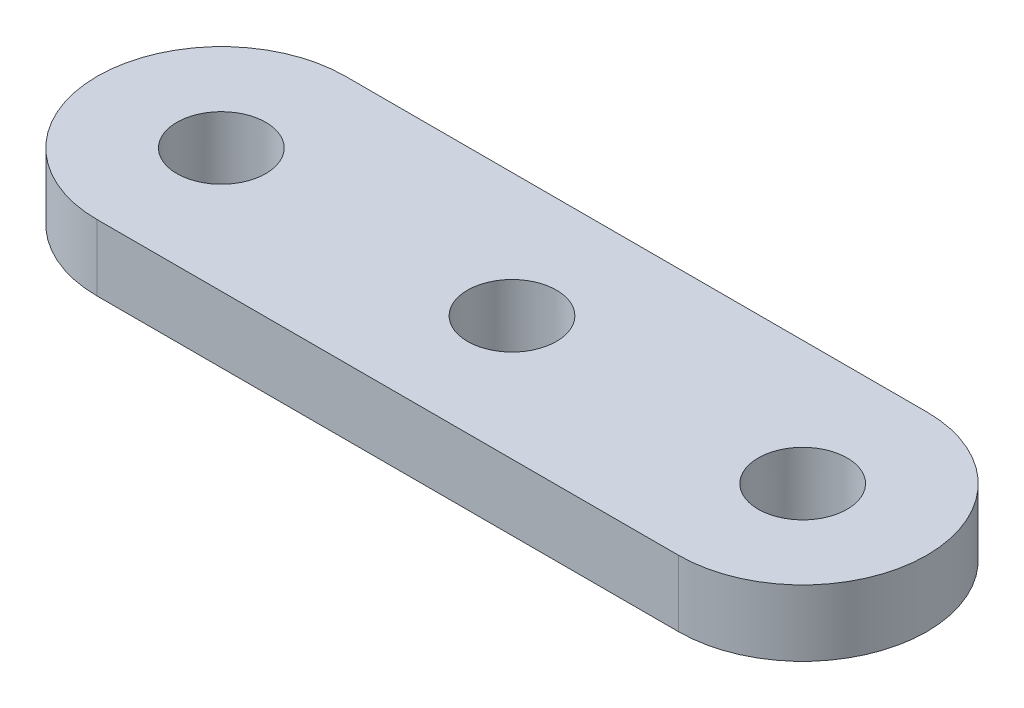
ISO-10303-21;
HEADER;
FILE_DESCRIPTION(('STEP AP214'),'2;1');
FILE_NAME('part.step','',(''),(''),'','','');
FILE_SCHEMA(('AUTOMOTIVE_DESIGN { 1 0 10303 214 1 1 1 1 }'));
ENDSEC;
DATA;
#1=APPLICATION_CONTEXT('core data for automotive mechanical design processes');
#2=APPLICATION_PROTOCOL_DEFINITION('international standard','automotive_design',2000,#1);
#3=PRODUCT_CONTEXT('',#1,'mechanical');
#4=PRODUCT('Part','Part','',(#3));
#5=PRODUCT_RELATED_PRODUCT_CATEGORY('part','',(#4));
#6=PRODUCT_DEFINITION_FORMATION('','',#4);
#7=PRODUCT_DEFINITION_CONTEXT('part definition',#1,'design');
#8=PRODUCT_DEFINITION('design','',#6,#7);
#9=PRODUCT_DEFINITION_SHAPE('','',#8);
#10=(LENGTH_UNIT() NAMED_UNIT(*) SI_UNIT(.MILLI.,.METRE.));
#11=(NAMED_UNIT(*) PLANE_ANGLE_UNIT() SI_UNIT($,.RADIAN.));
#12=(NAMED_UNIT(*) SI_UNIT($,.STERADIAN.) SOLID_ANGLE_UNIT());
#13=UNCERTAINTY_MEASURE_WITH_UNIT(LENGTH_MEASURE(1.E-05),#10,'distance_accuracy_value','');
#14=(GEOMETRIC_REPRESENTATION_CONTEXT(3) GLOBAL_UNCERTAINTY_ASSIGNED_CONTEXT((#13)) GLOBAL_UNIT_ASSIGNED_CONTEXT((#10,
#11,#12)) REPRESENTATION_CONTEXT('',''));
#15=CARTESIAN_POINT('',(0.,0.,0.));
#16=DIRECTION('',(0.,0.,1.));
#17=DIRECTION('',(1.,0.,0.));
#18=AXIS2_PLACEMENT_3D('',#15,#16,#17);
#19=CARTESIAN_POINT('',(14.05,3.2,0.));
#20=DIRECTION('',(0.,-1.,0.));
#21=DIRECTION('',(0.,0.,-1.));
#22=AXIS2_PLACEMENT_3D('',#19,#20,#21);
#23=PLANE('',#22);
#24=CARTESIAN_POINT('',(0.,3.2,0.));
#25=DIRECTION('',(0.,1.,0.));
#26=DIRECTION('',(0.,0.,1.));
#27=AXIS2_PLACEMENT_3D('',#24,#25,#26);
#28=CIRCLE('',#27,2.15);
#29=CARTESIAN_POINT('',(0.,3.2,2.15));
#30=VERTEX_POINT('',#29);
#31=EDGE_CURVE('E137',#30,#30,#28,.T.);
#32=ORIENTED_EDGE('',*,*,#31,.F.);
#33=EDGE_LOOP('',(#32));
#34=FACE_BOUND('',#33,.T.);
#35=CARTESIAN_POINT('',(14.05,3.2,0.));
#36=DIRECTION('',(0.,1.,0.));
#37=DIRECTION('',(0.,0.,-1.));
#38=AXIS2_PLACEMENT_3D('',#35,#36,#37);
#39=CIRCLE('',#38,6.);
#40=CARTESIAN_POINT('',(14.05,3.2,6.));
#41=VERTEX_POINT('',#40);
#42=CARTESIAN_POINT('',(14.05,3.2,-6.00000000000001));
#43=VERTEX_POINT('',#42);
#44=EDGE_CURVE('E97',#41,#43,#39,.T.);
#45=ORIENTED_EDGE('',*,*,#44,.T.);
#46=DIRECTION('',(-1.,0.,0.));
#47=VECTOR('',#46,1.);
#48=CARTESIAN_POINT('',(-14.05,3.2,-6.));
#49=LINE('',#48,#47);
#50=CARTESIAN_POINT('',(-14.05,3.2,-6.));
#51=VERTEX_POINT('',#50);
#52=EDGE_CURVE('E92',#43,#51,#49,.T.);
#53=ORIENTED_EDGE('',*,*,#52,.T.);
#54=CARTESIAN_POINT('',(-14.05,3.2,0.));
#55=DIRECTION('',(0.,1.,0.));
#56=DIRECTION('',(0.,0.,1.));
#57=AXIS2_PLACEMENT_3D('',#54,#55,#56);
#58=CIRCLE('',#57,6.);
#59=CARTESIAN_POINT('',(-14.05,3.2,6.));
#60=VERTEX_POINT('',#59);
#61=EDGE_CURVE('E95',#51,#60,#58,.T.);
#62=ORIENTED_EDGE('',*,*,#61,.T.);
#63=DIRECTION('',(1.,0.,0.));
#64=VECTOR('',#63,1.);
#65=CARTESIAN_POINT('',(-14.05,3.2,6.));
#66=LINE('',#65,#64);
#67=EDGE_CURVE('E62',#60,#41,#66,.T.);
#68=ORIENTED_EDGE('',*,*,#67,.T.);
#69=EDGE_LOOP('',(#45,#53,#62,#68));
#70=FACE_BOUND('',#69,.T.);
#71=CARTESIAN_POINT('',(-14.05,3.2,0.));
#72=DIRECTION('',(0.,1.,0.));
#73=DIRECTION('',(0.,0.,1.));
#74=AXIS2_PLACEMENT_3D('',#71,#72,#73);
#75=CIRCLE('',#74,2.15);
#76=CARTESIAN_POINT('',(-14.05,3.2,2.15));
#77=VERTEX_POINT('',#76);
#78=EDGE_CURVE('E125',#77,#77,#75,.T.);
#79=ORIENTED_EDGE('',*,*,#78,.F.);
#80=EDGE_LOOP('',(#79));
#81=FACE_BOUND('',#80,.T.);
#82=CARTESIAN_POINT('',(14.05,3.2,0.));
#83=DIRECTION('',(0.,1.,0.));
#84=DIRECTION('',(0.,0.,1.));
#85=AXIS2_PLACEMENT_3D('',#82,#83,#84);
#86=CIRCLE('',#85,2.15);
#87=CARTESIAN_POINT('',(14.05,3.2,2.15000000000001));
#88=VERTEX_POINT('',#87);
#89=EDGE_CURVE('E131',#88,#88,#86,.T.);
#90=ORIENTED_EDGE('',*,*,#89,.F.);
#91=EDGE_LOOP('',(#90));
#92=FACE_BOUND('',#91,.T.);
#93=ADVANCED_FACE('F45',(#34,#70,#81,#92),#23,.F.);
#94=CARTESIAN_POINT('',(14.05,3.2,0.));
#95=DIRECTION('',(0.,-1.,0.));
#96=DIRECTION('',(0.,0.,-1.));
#97=AXIS2_PLACEMENT_3D('',#94,#95,#96);
#98=CYLINDRICAL_SURFACE('',#97,6.);
#99=CARTESIAN_POINT('',(14.05,0.,0.));
#100=DIRECTION('',(0.,1.,0.));
#101=DIRECTION('',(0.,0.,-1.));
#102=AXIS2_PLACEMENT_3D('',#99,#100,#101);
#103=CIRCLE('',#102,6.);
#104=CARTESIAN_POINT('',(14.05,0.,6.));
#105=VERTEX_POINT('',#104);
#106=CARTESIAN_POINT('',(14.05,0.,-6.00000000000001));
#107=VERTEX_POINT('',#106);
#108=EDGE_CURVE('E109',#105,#107,#103,.T.);
#109=ORIENTED_EDGE('',*,*,#108,.T.);
#110=DIRECTION('',(0.,-1.,0.));
#111=VECTOR('',#110,1.);
#112=CARTESIAN_POINT('',(14.05,3.2,-6.00000000000001));
#113=LINE('',#112,#111);
#114=EDGE_CURVE('E11',#43,#107,#113,.T.);
#115=ORIENTED_EDGE('',*,*,#114,.F.);
#116=ORIENTED_EDGE('',*,*,#44,.F.);
#117=DIRECTION('',(0.,-1.,0.));
#118=VECTOR('',#117,1.);
#119=CARTESIAN_POINT('',(14.05,3.2,6.));
#120=LINE('',#119,#118);
#121=EDGE_CURVE('E105',#41,#105,#120,.T.);
#122=ORIENTED_EDGE('',*,*,#121,.T.);
#123=EDGE_LOOP('',(#109,#115,#116,#122));
#124=FACE_BOUND('',#123,.T.);
#125=ADVANCED_FACE('F47',(#124),#98,.T.);
#126=CARTESIAN_POINT('',(-14.05,3.2,-6.));
#127=DIRECTION('',(0.,0.,1.));
#128=DIRECTION('',(1.,0.,0.));
#129=AXIS2_PLACEMENT_3D('',#126,#127,#128);
#130=PLANE('',#129);
#131=DIRECTION('',(-1.,0.,0.));
#132=VECTOR('',#131,1.);
#133=CARTESIAN_POINT('',(-14.05,0.,-6.));
#134=LINE('',#133,#132);
#135=CARTESIAN_POINT('',(-14.05,0.,-6.));
#136=VERTEX_POINT('',#135);
#137=EDGE_CURVE('E101',#107,#136,#134,.T.);
#138=ORIENTED_EDGE('',*,*,#137,.T.);
#139=DIRECTION('',(0.,-1.,0.));
#140=VECTOR('',#139,1.);
#141=CARTESIAN_POINT('',(-14.05,3.2,-6.));
#142=LINE('',#141,#140);
#143=EDGE_CURVE('E54',#51,#136,#142,.T.);
#144=ORIENTED_EDGE('',*,*,#143,.F.);
#145=ORIENTED_EDGE('',*,*,#52,.F.);
#146=ORIENTED_EDGE('',*,*,#114,.T.);
#147=EDGE_LOOP('',(#138,#144,#145,#146));
#148=FACE_BOUND('',#147,.T.);
#149=ADVANCED_FACE('F100',(#148),#130,.F.);
#150=CARTESIAN_POINT('',(-14.05,3.2,0.));
#151=DIRECTION('',(0.,-1.,0.));
#152=DIRECTION('',(0.,0.,-1.));
#153=AXIS2_PLACEMENT_3D('',#150,#151,#152);
#154=CYLINDRICAL_SURFACE('',#153,6.);
#155=CARTESIAN_POINT('',(-14.05,0.,0.));
#156=DIRECTION('',(0.,1.,0.));
#157=DIRECTION('',(0.,0.,1.));
#158=AXIS2_PLACEMENT_3D('',#155,#156,#157);
#159=CIRCLE('',#158,6.);
#160=CARTESIAN_POINT('',(-14.05,0.,6.));
#161=VERTEX_POINT('',#160);
#162=EDGE_CURVE('E79',#136,#161,#159,.T.);
#163=ORIENTED_EDGE('',*,*,#162,.T.);
#164=DIRECTION('',(0.,-1.,0.));
#165=VECTOR('',#164,1.);
#166=CARTESIAN_POINT('',(-14.05,3.2,6.));
#167=LINE('',#166,#165);
#168=EDGE_CURVE('E102',#60,#161,#167,.T.);
#169=ORIENTED_EDGE('',*,*,#168,.F.);
#170=ORIENTED_EDGE('',*,*,#61,.F.);
#171=ORIENTED_EDGE('',*,*,#143,.T.);
#172=EDGE_LOOP('',(#163,#169,#170,#171));
#173=FACE_BOUND('',#172,.T.);
#174=ADVANCED_FACE('F103',(#173),#154,.T.);
#175=CARTESIAN_POINT('',(-14.05,3.2,6.));
#176=DIRECTION('',(0.,0.,-1.));
#177=DIRECTION('',(-1.,0.,0.));
#178=AXIS2_PLACEMENT_3D('',#175,#176,#177);
#179=PLANE('',#178);
#180=DIRECTION('',(1.,0.,0.));
#181=VECTOR('',#180,1.);
#182=CARTESIAN_POINT('',(-14.05,0.,6.));
#183=LINE('',#182,#181);
#184=EDGE_CURVE('E85',#161,#105,#183,.T.);
#185=ORIENTED_EDGE('',*,*,#184,.T.);
#186=ORIENTED_EDGE('',*,*,#121,.F.);
#187=ORIENTED_EDGE('',*,*,#67,.F.);
#188=ORIENTED_EDGE('',*,*,#168,.T.);
#189=EDGE_LOOP('',(#185,#186,#187,#188));
#190=FACE_BOUND('',#189,.T.);
#191=ADVANCED_FACE('F117',(#190),#179,.F.);
#192=CARTESIAN_POINT('',(14.05,0.,0.));
#193=DIRECTION('',(0.,-1.,0.));
#194=DIRECTION('',(0.,0.,-1.));
#195=AXIS2_PLACEMENT_3D('',#192,#193,#194);
#196=PLANE('',#195);
#197=CARTESIAN_POINT('',(0.,0.,0.));
#198=DIRECTION('',(0.,-1.,0.));
#199=DIRECTION('',(0.,0.,-1.));
#200=AXIS2_PLACEMENT_3D('',#197,#198,#199);
#201=CIRCLE('',#200,2.15);
#202=CARTESIAN_POINT('',(0.,0.,-2.15));
#203=VERTEX_POINT('',#202);
#204=EDGE_CURVE('E134',#203,#203,#201,.T.);
#205=ORIENTED_EDGE('',*,*,#204,.F.);
#206=EDGE_LOOP('',(#205));
#207=FACE_BOUND('',#206,.T.);
#208=CARTESIAN_POINT('',(14.05,0.,0.));
#209=DIRECTION('',(0.,-1.,0.));
#210=DIRECTION('',(0.,0.,-1.));
#211=AXIS2_PLACEMENT_3D('',#208,#209,#210);
#212=CIRCLE('',#211,2.15);
#213=CARTESIAN_POINT('',(14.05,0.,-2.14999999999999));
#214=VERTEX_POINT('',#213);
#215=EDGE_CURVE('E128',#214,#214,#212,.T.);
#216=ORIENTED_EDGE('',*,*,#215,.F.);
#217=EDGE_LOOP('',(#216));
#218=FACE_BOUND('',#217,.T.);
#219=CARTESIAN_POINT('',(-14.05,0.,0.));
#220=DIRECTION('',(0.,-1.,0.));
#221=DIRECTION('',(0.,0.,-1.));
#222=AXIS2_PLACEMENT_3D('',#219,#220,#221);
#223=CIRCLE('',#222,2.15);
#224=CARTESIAN_POINT('',(-14.05,0.,-2.15));
#225=VERTEX_POINT('',#224);
#226=EDGE_CURVE('E112',#225,#225,#223,.T.);
#227=ORIENTED_EDGE('',*,*,#226,.F.);
#228=EDGE_LOOP('',(#227));
#229=FACE_BOUND('',#228,.T.);
#230=ORIENTED_EDGE('',*,*,#108,.F.);
#231=ORIENTED_EDGE('',*,*,#184,.F.);
#232=ORIENTED_EDGE('',*,*,#162,.F.);
#233=ORIENTED_EDGE('',*,*,#137,.F.);
#234=EDGE_LOOP('',(#230,#231,#232,#233));
#235=FACE_BOUND('',#234,.T.);
#236=ADVANCED_FACE('F120',(#207,#218,#229,#235),#196,.T.);
#237=CARTESIAN_POINT('',(-14.05,3.2,0.));
#238=DIRECTION('',(0.,1.,0.));
#239=DIRECTION('',(0.,0.,1.));
#240=AXIS2_PLACEMENT_3D('',#237,#238,#239);
#241=CYLINDRICAL_SURFACE('',#240,2.15);
#242=ORIENTED_EDGE('',*,*,#78,.T.);
#243=EDGE_LOOP('',(#242));
#244=FACE_BOUND('',#243,.T.);
#245=ORIENTED_EDGE('',*,*,#226,.T.);
#246=EDGE_LOOP('',(#245));
#247=FACE_BOUND('',#246,.T.);
#248=ADVANCED_FACE('F151',(#244,#247),#241,.F.);
#249=CARTESIAN_POINT('',(14.05,3.2,0.));
#250=DIRECTION('',(0.,1.,0.));
#251=DIRECTION('',(0.,0.,1.));
#252=AXIS2_PLACEMENT_3D('',#249,#250,#251);
#253=CYLINDRICAL_SURFACE('',#252,2.15);
#254=ORIENTED_EDGE('',*,*,#89,.T.);
#255=EDGE_LOOP('',(#254));
#256=FACE_BOUND('',#255,.T.);
#257=ORIENTED_EDGE('',*,*,#215,.T.);
#258=EDGE_LOOP('',(#257));
#259=FACE_BOUND('',#258,.T.);
#260=ADVANCED_FACE('F206',(#256,#259),#253,.F.);
#261=CARTESIAN_POINT('',(0.,3.2,0.));
#262=DIRECTION('',(0.,1.,0.));
#263=DIRECTION('',(0.,0.,1.));
#264=AXIS2_PLACEMENT_3D('',#261,#262,#263);
#265=CYLINDRICAL_SURFACE('',#264,2.15);
#266=ORIENTED_EDGE('',*,*,#31,.T.);
#267=EDGE_LOOP('',(#266));
#268=FACE_BOUND('',#267,.T.);
#269=ORIENTED_EDGE('',*,*,#204,.T.);
#270=EDGE_LOOP('',(#269));
#271=FACE_BOUND('',#270,.T.);
#272=ADVANCED_FACE('F141',(#268,#271),#265,.F.);
#273=CLOSED_SHELL('',(#93,#125,#149,#174,#191,#236,#248,#260,#272));
#274=MANIFOLD_SOLID_BREP('B2',#273);
#275=ADVANCED_BREP_SHAPE_REPRESENTATION('',(#18,#274),#14);
#276=SHAPE_DEFINITION_REPRESENTATION(#9,#275);
ENDSEC;
END-ISO-10303-21;
